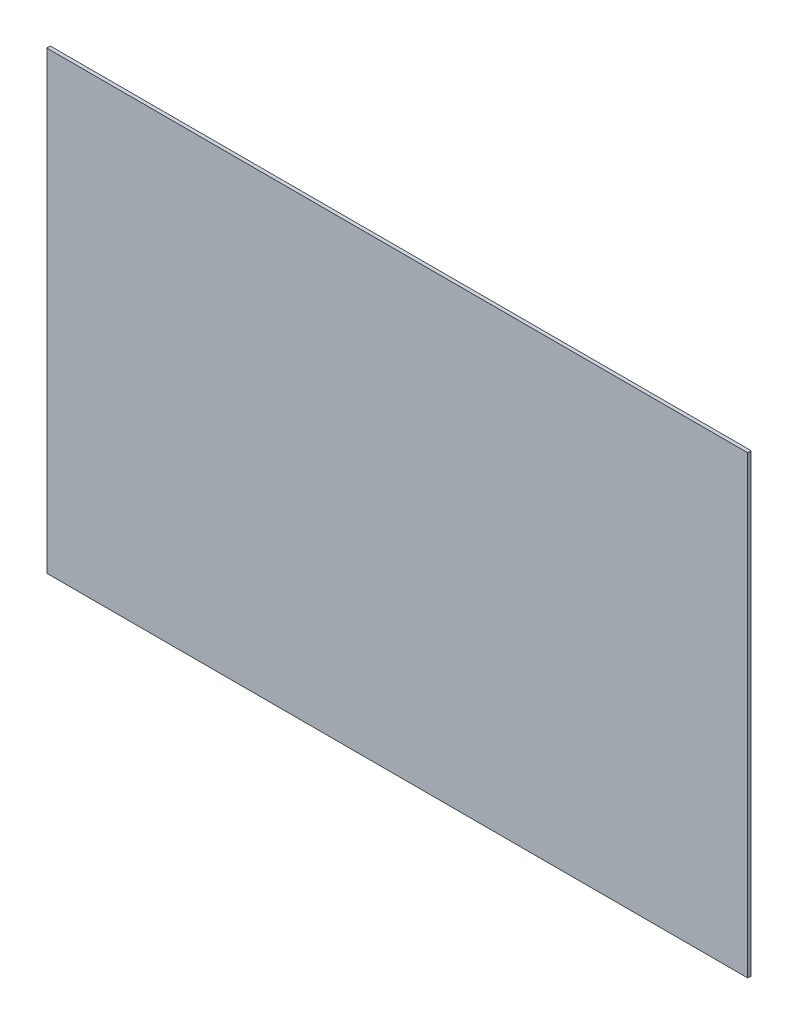
ISO-10303-21;
HEADER;
FILE_DESCRIPTION(('STEP AP214'),'2;1');
FILE_NAME('part.step','',(''),(''),'','','');
FILE_SCHEMA(('AUTOMOTIVE_DESIGN { 1 0 10303 214 1 1 1 1 }'));
ENDSEC;
DATA;
#1=APPLICATION_CONTEXT('core data for automotive mechanical design processes');
#2=APPLICATION_PROTOCOL_DEFINITION('international standard','automotive_design',2000,#1);
#3=PRODUCT_CONTEXT('',#1,'mechanical');
#4=PRODUCT('Part','Part','',(#3));
#5=PRODUCT_RELATED_PRODUCT_CATEGORY('part','',(#4));
#6=PRODUCT_DEFINITION_FORMATION('','',#4);
#7=PRODUCT_DEFINITION_CONTEXT('part definition',#1,'design');
#8=PRODUCT_DEFINITION('design','',#6,#7);
#9=PRODUCT_DEFINITION_SHAPE('','',#8);
#10=(LENGTH_UNIT() NAMED_UNIT(*) SI_UNIT(.MILLI.,.METRE.));
#11=(NAMED_UNIT(*) PLANE_ANGLE_UNIT() SI_UNIT($,.RADIAN.));
#12=(NAMED_UNIT(*) SI_UNIT($,.STERADIAN.) SOLID_ANGLE_UNIT());
#13=UNCERTAINTY_MEASURE_WITH_UNIT(LENGTH_MEASURE(1.E-05),#10,'distance_accuracy_value','');
#14=(GEOMETRIC_REPRESENTATION_CONTEXT(3) GLOBAL_UNCERTAINTY_ASSIGNED_CONTEXT((#13)) GLOBAL_UNIT_ASSIGNED_CONTEXT((#10,
#11,#12)) REPRESENTATION_CONTEXT('',''));
#15=CARTESIAN_POINT('',(0.,0.,0.));
#16=DIRECTION('',(0.,0.,1.));
#17=DIRECTION('',(1.,0.,0.));
#18=AXIS2_PLACEMENT_3D('',#15,#16,#17);
#19=CARTESIAN_POINT('',(149.85,97.25,1.5));
#20=DIRECTION('',(-1.,0.,0.));
#21=DIRECTION('',(0.,-1.,0.));
#22=AXIS2_PLACEMENT_3D('',#19,#20,#21);
#23=PLANE('',#22);
#24=DIRECTION('',(0.,1.,0.));
#25=VECTOR('',#24,1.);
#26=CARTESIAN_POINT('',(149.85,97.25,0.));
#27=LINE('',#26,#25);
#28=CARTESIAN_POINT('',(149.85,-97.25,0.));
#29=VERTEX_POINT('',#28);
#30=CARTESIAN_POINT('',(149.85,97.25,0.));
#31=VERTEX_POINT('',#30);
#32=EDGE_CURVE('E101',#29,#31,#27,.T.);
#33=ORIENTED_EDGE('',*,*,#32,.T.);
#34=DIRECTION('',(0.,0.,-1.));
#35=VECTOR('',#34,1.);
#36=CARTESIAN_POINT('',(149.85,97.25,1.5));
#37=LINE('',#36,#35);
#38=CARTESIAN_POINT('',(149.85,97.25,1.5));
#39=VERTEX_POINT('',#38);
#40=EDGE_CURVE('E11',#39,#31,#37,.T.);
#41=ORIENTED_EDGE('',*,*,#40,.F.);
#42=DIRECTION('',(0.,1.,0.));
#43=VECTOR('',#42,1.);
#44=CARTESIAN_POINT('',(149.85,97.25,1.5));
#45=LINE('',#44,#43);
#46=CARTESIAN_POINT('',(149.85,-97.25,1.5));
#47=VERTEX_POINT('',#46);
#48=EDGE_CURVE('E89',#47,#39,#45,.T.);
#49=ORIENTED_EDGE('',*,*,#48,.F.);
#50=DIRECTION('',(0.,0.,-1.));
#51=VECTOR('',#50,1.);
#52=CARTESIAN_POINT('',(149.85,-97.25,1.5));
#53=LINE('',#52,#51);
#54=EDGE_CURVE('E97',#47,#29,#53,.T.);
#55=ORIENTED_EDGE('',*,*,#54,.T.);
#56=EDGE_LOOP('',(#33,#41,#49,#55));
#57=FACE_BOUND('',#56,.T.);
#58=ADVANCED_FACE('F38',(#57),#23,.F.);
#59=CARTESIAN_POINT('',(-149.85,97.25,1.5));
#60=DIRECTION('',(0.,-1.,0.));
#61=DIRECTION('',(0.,0.,-1.));
#62=AXIS2_PLACEMENT_3D('',#59,#60,#61);
#63=PLANE('',#62);
#64=DIRECTION('',(-1.,0.,0.));
#65=VECTOR('',#64,1.);
#66=CARTESIAN_POINT('',(-149.85,97.25,0.));
#67=LINE('',#66,#65);
#68=CARTESIAN_POINT('',(-149.85,97.25,0.));
#69=VERTEX_POINT('',#68);
#70=EDGE_CURVE('E93',#31,#69,#67,.T.);
#71=ORIENTED_EDGE('',*,*,#70,.T.);
#72=DIRECTION('',(0.,0.,-1.));
#73=VECTOR('',#72,1.);
#74=CARTESIAN_POINT('',(-149.85,97.25,1.5));
#75=LINE('',#74,#73);
#76=CARTESIAN_POINT('',(-149.85,97.25,1.5));
#77=VERTEX_POINT('',#76);
#78=EDGE_CURVE('E46',#77,#69,#75,.T.);
#79=ORIENTED_EDGE('',*,*,#78,.F.);
#80=DIRECTION('',(-1.,0.,0.));
#81=VECTOR('',#80,1.);
#82=CARTESIAN_POINT('',(-149.85,97.25,1.5));
#83=LINE('',#82,#81);
#84=EDGE_CURVE('E84',#39,#77,#83,.T.);
#85=ORIENTED_EDGE('',*,*,#84,.F.);
#86=ORIENTED_EDGE('',*,*,#40,.T.);
#87=EDGE_LOOP('',(#71,#79,#85,#86));
#88=FACE_BOUND('',#87,.T.);
#89=ADVANCED_FACE('F92',(#88),#63,.F.);
#90=CARTESIAN_POINT('',(-149.85,97.25,1.5));
#91=DIRECTION('',(1.,0.,0.));
#92=DIRECTION('',(0.,1.,0.));
#93=AXIS2_PLACEMENT_3D('',#90,#91,#92);
#94=PLANE('',#93);
#95=DIRECTION('',(0.,-1.,0.));
#96=VECTOR('',#95,1.);
#97=CARTESIAN_POINT('',(-149.85,97.25,0.));
#98=LINE('',#97,#96);
#99=CARTESIAN_POINT('',(-149.85,-97.25,0.));
#100=VERTEX_POINT('',#99);
#101=EDGE_CURVE('E71',#69,#100,#98,.T.);
#102=ORIENTED_EDGE('',*,*,#101,.T.);
#103=DIRECTION('',(0.,0.,-1.));
#104=VECTOR('',#103,1.);
#105=CARTESIAN_POINT('',(-149.85,-97.25,1.5));
#106=LINE('',#105,#104);
#107=CARTESIAN_POINT('',(-149.85,-97.25,1.5));
#108=VERTEX_POINT('',#107);
#109=EDGE_CURVE('E94',#108,#100,#106,.T.);
#110=ORIENTED_EDGE('',*,*,#109,.F.);
#111=DIRECTION('',(0.,-1.,0.));
#112=VECTOR('',#111,1.);
#113=CARTESIAN_POINT('',(-149.85,97.25,1.5));
#114=LINE('',#113,#112);
#115=EDGE_CURVE('E87',#77,#108,#114,.T.);
#116=ORIENTED_EDGE('',*,*,#115,.F.);
#117=ORIENTED_EDGE('',*,*,#78,.T.);
#118=EDGE_LOOP('',(#102,#110,#116,#117));
#119=FACE_BOUND('',#118,.T.);
#120=ADVANCED_FACE('F95',(#119),#94,.F.);
#121=CARTESIAN_POINT('',(-149.85,-97.25,1.5));
#122=DIRECTION('',(0.,1.,0.));
#123=DIRECTION('',(0.,0.,1.));
#124=AXIS2_PLACEMENT_3D('',#121,#122,#123);
#125=PLANE('',#124);
#126=DIRECTION('',(1.,0.,0.));
#127=VECTOR('',#126,1.);
#128=CARTESIAN_POINT('',(-149.85,-97.25,0.));
#129=LINE('',#128,#127);
#130=EDGE_CURVE('E77',#100,#29,#129,.T.);
#131=ORIENTED_EDGE('',*,*,#130,.T.);
#132=ORIENTED_EDGE('',*,*,#54,.F.);
#133=DIRECTION('',(1.,0.,0.));
#134=VECTOR('',#133,1.);
#135=CARTESIAN_POINT('',(-149.85,-97.25,1.5));
#136=LINE('',#135,#134);
#137=EDGE_CURVE('E54',#108,#47,#136,.T.);
#138=ORIENTED_EDGE('',*,*,#137,.F.);
#139=ORIENTED_EDGE('',*,*,#109,.T.);
#140=EDGE_LOOP('',(#131,#132,#138,#139));
#141=FACE_BOUND('',#140,.T.);
#142=ADVANCED_FACE('F108',(#141),#125,.F.);
#143=CARTESIAN_POINT('',(0.,0.,1.5));
#144=DIRECTION('',(0.,0.,1.));
#145=DIRECTION('',(1.,0.,0.));
#146=AXIS2_PLACEMENT_3D('',#143,#144,#145);
#147=PLANE('',#146);
#148=ORIENTED_EDGE('',*,*,#48,.T.);
#149=ORIENTED_EDGE('',*,*,#84,.T.);
#150=ORIENTED_EDGE('',*,*,#115,.T.);
#151=ORIENTED_EDGE('',*,*,#137,.T.);
#152=EDGE_LOOP('',(#148,#149,#150,#151));
#153=FACE_BOUND('',#152,.T.);
#154=ADVANCED_FACE('F85',(#153),#147,.T.);
#155=CARTESIAN_POINT('',(0.,0.,0.));
#156=DIRECTION('',(0.,0.,1.));
#157=DIRECTION('',(1.,0.,0.));
#158=AXIS2_PLACEMENT_3D('',#155,#156,#157);
#159=PLANE('',#158);
#160=ORIENTED_EDGE('',*,*,#32,.F.);
#161=ORIENTED_EDGE('',*,*,#130,.F.);
#162=ORIENTED_EDGE('',*,*,#101,.F.);
#163=ORIENTED_EDGE('',*,*,#70,.F.);
#164=EDGE_LOOP('',(#160,#161,#162,#163));
#165=FACE_BOUND('',#164,.T.);
#166=ADVANCED_FACE('F111',(#165),#159,.F.);
#167=CLOSED_SHELL('',(#58,#89,#120,#142,#154,#166));
#168=MANIFOLD_SOLID_BREP('B2',#167);
#169=ADVANCED_BREP_SHAPE_REPRESENTATION('',(#18,#168),#14);
#170=SHAPE_DEFINITION_REPRESENTATION(#9,#169);
ENDSEC;
END-ISO-10303-21;
